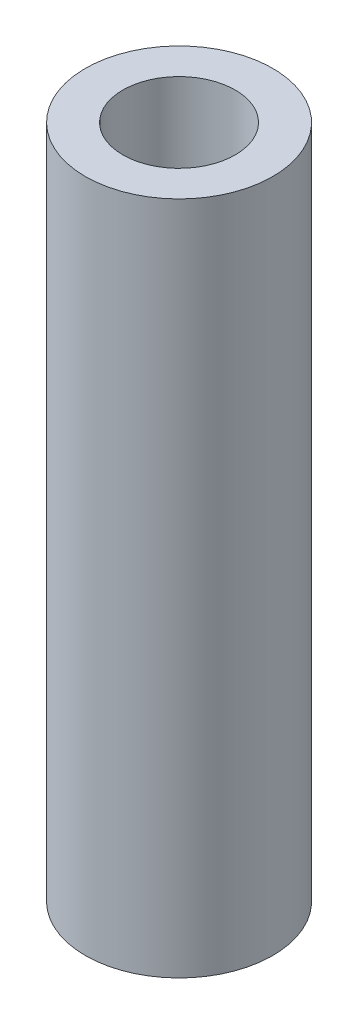
ISO-10303-21;
HEADER;
FILE_DESCRIPTION(('STEP AP214'),'2;1');
FILE_NAME('part.step','',(''),(''),'','','');
FILE_SCHEMA(('AUTOMOTIVE_DESIGN { 1 0 10303 214 1 1 1 1 }'));
ENDSEC;
DATA;
#1=APPLICATION_CONTEXT('core data for automotive mechanical design processes');
#2=APPLICATION_PROTOCOL_DEFINITION('international standard','automotive_design',2000,#1);
#3=PRODUCT_CONTEXT('',#1,'mechanical');
#4=PRODUCT('Part','Part','',(#3));
#5=PRODUCT_RELATED_PRODUCT_CATEGORY('part','',(#4));
#6=PRODUCT_DEFINITION_FORMATION('','',#4);
#7=PRODUCT_DEFINITION_CONTEXT('part definition',#1,'design');
#8=PRODUCT_DEFINITION('design','',#6,#7);
#9=PRODUCT_DEFINITION_SHAPE('','',#8);
#10=(LENGTH_UNIT() NAMED_UNIT(*) SI_UNIT(.MILLI.,.METRE.));
#11=(NAMED_UNIT(*) PLANE_ANGLE_UNIT() SI_UNIT($,.RADIAN.));
#12=(NAMED_UNIT(*) SI_UNIT($,.STERADIAN.) SOLID_ANGLE_UNIT());
#13=UNCERTAINTY_MEASURE_WITH_UNIT(LENGTH_MEASURE(1.E-05),#10,'distance_accuracy_value','');
#14=(GEOMETRIC_REPRESENTATION_CONTEXT(3) GLOBAL_UNCERTAINTY_ASSIGNED_CONTEXT((#13)) GLOBAL_UNIT_ASSIGNED_CONTEXT((#10,
#11,#12)) REPRESENTATION_CONTEXT('',''));
#15=CARTESIAN_POINT('',(0.,0.,0.));
#16=DIRECTION('',(0.,0.,1.));
#17=DIRECTION('',(1.,0.,0.));
#18=AXIS2_PLACEMENT_3D('',#15,#16,#17);
#19=CARTESIAN_POINT('',(0.,18.,0.));
#20=DIRECTION('',(0.,1.,0.));
#21=DIRECTION('',(0.,0.,1.));
#22=AXIS2_PLACEMENT_3D('',#19,#20,#21);
#23=PLANE('',#22);
#24=CARTESIAN_POINT('',(0.,18.,0.));
#25=DIRECTION('',(0.,1.,0.));
#26=DIRECTION('',(0.,0.,1.));
#27=AXIS2_PLACEMENT_3D('',#24,#25,#26);
#28=CIRCLE('',#27,2.5);
#29=CARTESIAN_POINT('',(0.,18.,2.5));
#30=VERTEX_POINT('',#29);
#31=EDGE_CURVE('E10',#30,#30,#28,.T.);
#32=ORIENTED_EDGE('',*,*,#31,.T.);
#33=EDGE_LOOP('',(#32));
#34=FACE_BOUND('',#33,.T.);
#35=CARTESIAN_POINT('',(0.,18.,0.));
#36=DIRECTION('',(0.,1.,0.));
#37=DIRECTION('',(0.,0.,1.));
#38=AXIS2_PLACEMENT_3D('',#35,#36,#37);
#39=CIRCLE('',#38,1.5);
#40=CARTESIAN_POINT('',(0.,18.,1.5));
#41=VERTEX_POINT('',#40);
#42=EDGE_CURVE('E53',#41,#41,#39,.T.);
#43=ORIENTED_EDGE('',*,*,#42,.F.);
#44=EDGE_LOOP('',(#43));
#45=FACE_BOUND('',#44,.T.);
#46=ADVANCED_FACE('F40',(#34,#45),#23,.T.);
#47=CARTESIAN_POINT('',(0.,0.,0.));
#48=DIRECTION('',(0.,1.,0.));
#49=DIRECTION('',(0.,0.,1.));
#50=AXIS2_PLACEMENT_3D('',#47,#48,#49);
#51=PLANE('',#50);
#52=CARTESIAN_POINT('',(0.,0.,0.));
#53=DIRECTION('',(0.,1.,0.));
#54=DIRECTION('',(0.,0.,1.));
#55=AXIS2_PLACEMENT_3D('',#52,#53,#54);
#56=CIRCLE('',#55,2.5);
#57=CARTESIAN_POINT('',(0.,0.,2.5));
#58=VERTEX_POINT('',#57);
#59=EDGE_CURVE('E44',#58,#58,#56,.T.);
#60=ORIENTED_EDGE('',*,*,#59,.F.);
#61=EDGE_LOOP('',(#60));
#62=FACE_BOUND('',#61,.T.);
#63=CARTESIAN_POINT('',(0.,0.,0.));
#64=DIRECTION('',(0.,1.,0.));
#65=DIRECTION('',(0.,0.,1.));
#66=AXIS2_PLACEMENT_3D('',#63,#64,#65);
#67=CIRCLE('',#66,1.5);
#68=CARTESIAN_POINT('',(0.,0.,1.5));
#69=VERTEX_POINT('',#68);
#70=EDGE_CURVE('E55',#69,#69,#67,.T.);
#71=ORIENTED_EDGE('',*,*,#70,.T.);
#72=EDGE_LOOP('',(#71));
#73=FACE_BOUND('',#72,.T.);
#74=ADVANCED_FACE('F67',(#62,#73),#51,.F.);
#75=CARTESIAN_POINT('',(0.,18.,0.));
#76=DIRECTION('',(0.,-1.,0.));
#77=DIRECTION('',(0.,0.,-1.));
#78=AXIS2_PLACEMENT_3D('',#75,#76,#77);
#79=CYLINDRICAL_SURFACE('',#78,2.5);
#80=ORIENTED_EDGE('',*,*,#31,.F.);
#81=EDGE_LOOP('',(#80));
#82=FACE_BOUND('',#81,.T.);
#83=ORIENTED_EDGE('',*,*,#59,.T.);
#84=EDGE_LOOP('',(#83));
#85=FACE_BOUND('',#84,.T.);
#86=ADVANCED_FACE('F42',(#82,#85),#79,.T.);
#87=CARTESIAN_POINT('',(0.,18.,0.));
#88=DIRECTION('',(0.,-1.,0.));
#89=DIRECTION('',(0.,0.,-1.));
#90=AXIS2_PLACEMENT_3D('',#87,#88,#89);
#91=CYLINDRICAL_SURFACE('',#90,1.5);
#92=ORIENTED_EDGE('',*,*,#42,.T.);
#93=EDGE_LOOP('',(#92));
#94=FACE_BOUND('',#93,.T.);
#95=ORIENTED_EDGE('',*,*,#70,.F.);
#96=EDGE_LOOP('',(#95));
#97=FACE_BOUND('',#96,.T.);
#98=ADVANCED_FACE('F63',(#94,#97),#91,.F.);
#99=CLOSED_SHELL('',(#46,#74,#86,#98));
#100=MANIFOLD_SOLID_BREP('B2',#99);
#101=ADVANCED_BREP_SHAPE_REPRESENTATION('',(#18,#100),#14);
#102=SHAPE_DEFINITION_REPRESENTATION(#9,#101);
ENDSEC;
END-ISO-10303-21;
